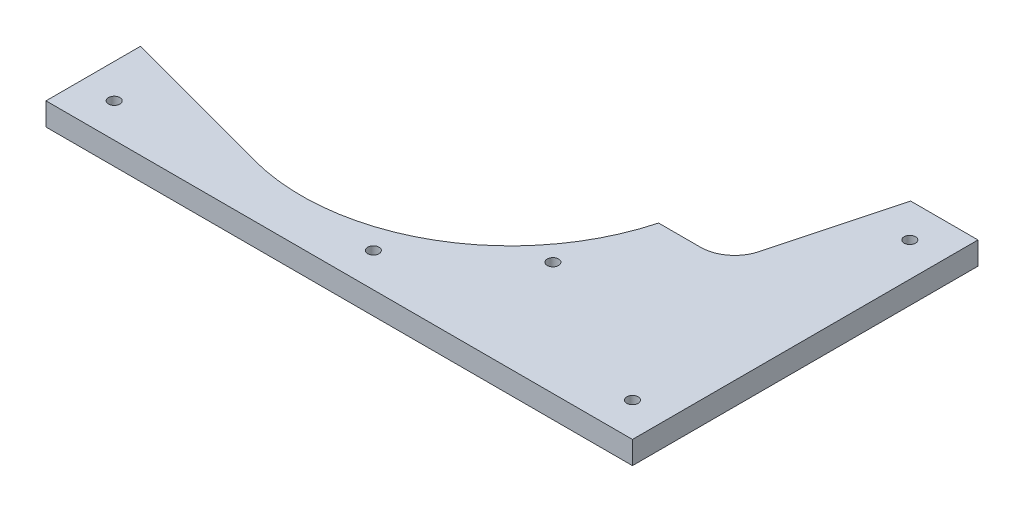
ISO-10303-21;
HEADER;
FILE_DESCRIPTION(('STEP AP214'),'2;1');
FILE_NAME('part.step','',(''),(''),'','','');
FILE_SCHEMA(('AUTOMOTIVE_DESIGN { 1 0 10303 214 1 1 1 1 }'));
ENDSEC;
DATA;
#1=APPLICATION_CONTEXT('core data for automotive mechanical design processes');
#2=APPLICATION_PROTOCOL_DEFINITION('international standard','automotive_design',2000,#1);
#3=PRODUCT_CONTEXT('',#1,'mechanical');
#4=PRODUCT('Part','Part','',(#3));
#5=PRODUCT_RELATED_PRODUCT_CATEGORY('part','',(#4));
#6=PRODUCT_DEFINITION_FORMATION('','',#4);
#7=PRODUCT_DEFINITION_CONTEXT('part definition',#1,'design');
#8=PRODUCT_DEFINITION('design','',#6,#7);
#9=PRODUCT_DEFINITION_SHAPE('','',#8);
#10=(LENGTH_UNIT() NAMED_UNIT(*) SI_UNIT(.MILLI.,.METRE.));
#11=(NAMED_UNIT(*) PLANE_ANGLE_UNIT() SI_UNIT($,.RADIAN.));
#12=(NAMED_UNIT(*) SI_UNIT($,.STERADIAN.) SOLID_ANGLE_UNIT());
#13=UNCERTAINTY_MEASURE_WITH_UNIT(LENGTH_MEASURE(1.E-05),#10,'distance_accuracy_value','');
#14=(GEOMETRIC_REPRESENTATION_CONTEXT(3) GLOBAL_UNCERTAINTY_ASSIGNED_CONTEXT((#13)) GLOBAL_UNIT_ASSIGNED_CONTEXT((#10,
#11,#12)) REPRESENTATION_CONTEXT('',''));
#15=CARTESIAN_POINT('',(0.,0.,0.));
#16=DIRECTION('',(0.,0.,1.));
#17=DIRECTION('',(1.,0.,0.));
#18=AXIS2_PLACEMENT_3D('',#15,#16,#17);
#19=CARTESIAN_POINT('',(0.,12.7,-116.84));
#20=DIRECTION('',(0.,-1.,0.));
#21=DIRECTION('',(0.,0.,-1.));
#22=AXIS2_PLACEMENT_3D('',#19,#20,#21);
#23=CYLINDRICAL_SURFACE('',#22,116.84);
#24=CARTESIAN_POINT('',(0.,0.,-116.84));
#25=DIRECTION('',(0.,1.,0.));
#26=DIRECTION('',(0.,0.,1.));
#27=AXIS2_PLACEMENT_3D('',#24,#25,#26);
#28=CIRCLE('',#27,116.84);
#29=CARTESIAN_POINT('',(-30.2404172297778,0.,-3.98122645638507));
#30=VERTEX_POINT('',#29);
#31=CARTESIAN_POINT('',(112.858773543615,0.,-86.5995827702219));
#32=VERTEX_POINT('',#31);
#33=EDGE_CURVE('E119',#30,#32,#28,.T.);
#34=ORIENTED_EDGE('',*,*,#33,.F.);
#35=DIRECTION('',(0.,-1.,0.));
#36=VECTOR('',#35,1.);
#37=CARTESIAN_POINT('',(-30.2404172297778,12.7,-3.98122645638507));
#38=LINE('',#37,#36);
#39=CARTESIAN_POINT('',(-30.2404172297778,12.7,-3.98122645638507));
#40=VERTEX_POINT('',#39);
#41=EDGE_CURVE('E113',#40,#30,#38,.T.);
#42=ORIENTED_EDGE('',*,*,#41,.F.);
#43=CARTESIAN_POINT('',(0.,12.7,-116.84));
#44=DIRECTION('',(0.,1.,0.));
#45=DIRECTION('',(0.,0.,1.));
#46=AXIS2_PLACEMENT_3D('',#43,#44,#45);
#47=CIRCLE('',#46,116.84);
#48=CARTESIAN_POINT('',(112.858773543615,12.7,-86.5995827702219));
#49=VERTEX_POINT('',#48);
#50=EDGE_CURVE('E116',#40,#49,#47,.T.);
#51=ORIENTED_EDGE('',*,*,#50,.T.);
#52=DIRECTION('',(0.,-1.,0.));
#53=VECTOR('',#52,1.);
#54=CARTESIAN_POINT('',(112.858773543615,12.7,-86.5995827702219));
#55=LINE('',#54,#53);
#56=EDGE_CURVE('E166',#49,#32,#55,.T.);
#57=ORIENTED_EDGE('',*,*,#56,.T.);
#58=EDGE_LOOP('',(#34,#42,#51,#57));
#59=FACE_BOUND('',#58,.T.);
#60=ADVANCED_FACE('F43',(#59),#23,.F.);
#61=CARTESIAN_POINT('',(-1.03041722977844,12.7,3.84556945452763));
#62=DIRECTION('',(-0.258819045102514,0.,0.96592582628907));
#63=DIRECTION('',(0.96592582628907,0.,0.258819045102514));
#64=AXIS2_PLACEMENT_3D('',#61,#62,#63);
#65=PLANE('',#64);
#66=DIRECTION('',(-0.96592582628907,0.,-0.258819045102514));
#67=VECTOR('',#66,1.);
#68=CARTESIAN_POINT('',(-1.03041722977844,0.,3.84556945452763));
#69=LINE('',#68,#67);
#70=CARTESIAN_POINT('',(-117.385646079675,0.,-27.3317201509397));
#71=VERTEX_POINT('',#70);
#72=EDGE_CURVE('E189',#30,#71,#69,.T.);
#73=ORIENTED_EDGE('',*,*,#72,.T.);
#74=DIRECTION('',(0.,-1.,0.));
#75=VECTOR('',#74,1.);
#76=CARTESIAN_POINT('',(-117.385646079675,12.7,-27.3317201509397));
#77=LINE('',#76,#75);
#78=CARTESIAN_POINT('',(-117.385646079675,12.7,-27.3317201509397));
#79=VERTEX_POINT('',#78);
#80=EDGE_CURVE('E125',#79,#71,#77,.T.);
#81=ORIENTED_EDGE('',*,*,#80,.F.);
#82=DIRECTION('',(-0.96592582628907,0.,-0.258819045102514));
#83=VECTOR('',#82,1.);
#84=CARTESIAN_POINT('',(-1.03041722977844,12.7,3.84556945452763));
#85=LINE('',#84,#83);
#86=EDGE_CURVE('E128',#40,#79,#85,.T.);
#87=ORIENTED_EDGE('',*,*,#86,.F.);
#88=ORIENTED_EDGE('',*,*,#41,.T.);
#89=EDGE_LOOP('',(#73,#81,#87,#88));
#90=FACE_BOUND('',#89,.T.);
#91=ADVANCED_FACE('F129',(#90),#65,.F.);
#92=CARTESIAN_POINT('',(-117.385646079675,12.7,0.));
#93=DIRECTION('',(-1.,0.,0.));
#94=DIRECTION('',(0.,0.,1.));
#95=AXIS2_PLACEMENT_3D('',#92,#93,#94);
#96=PLANE('',#95);
#97=DIRECTION('',(0.,0.,-1.));
#98=VECTOR('',#97,1.);
#99=CARTESIAN_POINT('',(-117.385646079675,0.,0.));
#100=LINE('',#99,#98);
#101=CARTESIAN_POINT('',(-117.385646079675,0.,25.4));
#102=VERTEX_POINT('',#101);
#103=EDGE_CURVE('E192',#102,#71,#100,.T.);
#104=ORIENTED_EDGE('',*,*,#103,.F.);
#105=DIRECTION('',(0.,-1.,0.));
#106=VECTOR('',#105,1.);
#107=CARTESIAN_POINT('',(-117.385646079675,12.7,25.4));
#108=LINE('',#107,#106);
#109=CARTESIAN_POINT('',(-117.385646079675,12.7,25.4));
#110=VERTEX_POINT('',#109);
#111=EDGE_CURVE('E227',#110,#102,#108,.T.);
#112=ORIENTED_EDGE('',*,*,#111,.F.);
#113=DIRECTION('',(0.,0.,-1.));
#114=VECTOR('',#113,1.);
#115=CARTESIAN_POINT('',(-117.385646079675,12.7,0.));
#116=LINE('',#115,#114);
#117=EDGE_CURVE('E134',#110,#79,#116,.T.);
#118=ORIENTED_EDGE('',*,*,#117,.T.);
#119=ORIENTED_EDGE('',*,*,#80,.T.);
#120=EDGE_LOOP('',(#104,#112,#118,#119));
#121=FACE_BOUND('',#120,.T.);
#122=ADVANCED_FACE('F248',(#121),#96,.T.);
#123=CARTESIAN_POINT('',(0.,12.7,25.4));
#124=DIRECTION('',(0.,0.,1.));
#125=DIRECTION('',(1.,0.,0.));
#126=AXIS2_PLACEMENT_3D('',#123,#124,#125);
#127=PLANE('',#126);
#128=DIRECTION('',(-1.,0.,0.));
#129=VECTOR('',#128,1.);
#130=CARTESIAN_POINT('',(0.,0.,25.4));
#131=LINE('',#130,#129);
#132=CARTESIAN_POINT('',(210.274353920325,0.,25.4));
#133=VERTEX_POINT('',#132);
#134=EDGE_CURVE('E196',#133,#102,#131,.T.);
#135=ORIENTED_EDGE('',*,*,#134,.F.);
#136=DIRECTION('',(0.,-1.,0.));
#137=VECTOR('',#136,1.);
#138=CARTESIAN_POINT('',(210.274353920325,12.7,25.4));
#139=LINE('',#138,#137);
#140=CARTESIAN_POINT('',(210.274353920325,12.7,25.4));
#141=VERTEX_POINT('',#140);
#142=EDGE_CURVE('E224',#141,#133,#139,.T.);
#143=ORIENTED_EDGE('',*,*,#142,.F.);
#144=DIRECTION('',(-1.,0.,0.));
#145=VECTOR('',#144,1.);
#146=CARTESIAN_POINT('',(0.,12.7,25.4));
#147=LINE('',#146,#145);
#148=EDGE_CURVE('E150',#141,#110,#147,.T.);
#149=ORIENTED_EDGE('',*,*,#148,.T.);
#150=ORIENTED_EDGE('',*,*,#111,.T.);
#151=EDGE_LOOP('',(#135,#143,#149,#150));
#152=FACE_BOUND('',#151,.T.);
#153=ADVANCED_FACE('F251',(#152),#127,.T.);
#154=CARTESIAN_POINT('',(210.274353920325,12.7,0.));
#155=DIRECTION('',(-1.,0.,0.));
#156=DIRECTION('',(0.,0.,1.));
#157=AXIS2_PLACEMENT_3D('',#154,#155,#156);
#158=PLANE('',#157);
#159=DIRECTION('',(0.,0.,-1.));
#160=VECTOR('',#159,1.);
#161=CARTESIAN_POINT('',(210.274353920325,0.,0.));
#162=LINE('',#161,#160);
#163=CARTESIAN_POINT('',(210.274353920325,0.,-167.64));
#164=VERTEX_POINT('',#163);
#165=EDGE_CURVE('E200',#133,#164,#162,.T.);
#166=ORIENTED_EDGE('',*,*,#165,.T.);
#167=DIRECTION('',(0.,-1.,0.));
#168=VECTOR('',#167,1.);
#169=CARTESIAN_POINT('',(210.274353920325,12.7,-167.64));
#170=LINE('',#169,#168);
#171=CARTESIAN_POINT('',(210.274353920325,12.7,-167.64));
#172=VERTEX_POINT('',#171);
#173=EDGE_CURVE('E221',#172,#164,#170,.T.);
#174=ORIENTED_EDGE('',*,*,#173,.F.);
#175=DIRECTION('',(0.,0.,-1.));
#176=VECTOR('',#175,1.);
#177=CARTESIAN_POINT('',(210.274353920325,12.7,0.));
#178=LINE('',#177,#176);
#179=EDGE_CURVE('E154',#141,#172,#178,.T.);
#180=ORIENTED_EDGE('',*,*,#179,.F.);
#181=ORIENTED_EDGE('',*,*,#142,.T.);
#182=EDGE_LOOP('',(#166,#174,#180,#181));
#183=FACE_BOUND('',#182,.T.);
#184=ADVANCED_FACE('F255',(#183),#158,.F.);
#185=CARTESIAN_POINT('',(0.,12.7,-167.64));
#186=DIRECTION('',(0.,0.,-1.));
#187=DIRECTION('',(-1.,0.,0.));
#188=AXIS2_PLACEMENT_3D('',#185,#186,#187);
#189=PLANE('',#188);
#190=DIRECTION('',(1.,0.,0.));
#191=VECTOR('',#190,1.);
#192=CARTESIAN_POINT('',(0.,0.,-167.64));
#193=LINE('',#192,#191);
#194=CARTESIAN_POINT('',(172.673487894615,0.,-167.64));
#195=VERTEX_POINT('',#194);
#196=EDGE_CURVE('E204',#195,#164,#193,.T.);
#197=ORIENTED_EDGE('',*,*,#196,.F.);
#198=DIRECTION('',(0.,-1.,0.));
#199=VECTOR('',#198,1.);
#200=CARTESIAN_POINT('',(172.673487894615,12.7,-167.64));
#201=LINE('',#200,#199);
#202=CARTESIAN_POINT('',(172.673487894615,12.7,-167.64));
#203=VERTEX_POINT('',#202);
#204=EDGE_CURVE('E217',#203,#195,#201,.T.);
#205=ORIENTED_EDGE('',*,*,#204,.F.);
#206=DIRECTION('',(1.,0.,0.));
#207=VECTOR('',#206,1.);
#208=CARTESIAN_POINT('',(0.,12.7,-167.64));
#209=LINE('',#208,#207);
#210=EDGE_CURVE('E157',#203,#172,#209,.T.);
#211=ORIENTED_EDGE('',*,*,#210,.T.);
#212=ORIENTED_EDGE('',*,*,#173,.T.);
#213=EDGE_LOOP('',(#197,#205,#211,#212));
#214=FACE_BOUND('',#213,.T.);
#215=ADVANCED_FACE('F260',(#214),#189,.T.);
#216=CARTESIAN_POINT('',(119.196557485709,12.7,31.9386213188652));
#217=DIRECTION('',(-0.965925826289069,0.,-0.258819045102518));
#218=DIRECTION('',(-0.258819045102518,0.,0.965925826289069));
#219=AXIS2_PLACEMENT_3D('',#216,#217,#218);
#220=PLANE('',#219);
#221=DIRECTION('',(0.258819045102518,0.,-0.965925826289069));
#222=VECTOR('',#221,1.);
#223=CARTESIAN_POINT('',(119.196557485709,0.,31.9386213188652));
#224=LINE('',#223,#222);
#225=CARTESIAN_POINT('',(154.742081413422,0.,-100.719079961019));
#226=VERTEX_POINT('',#225);
#227=EDGE_CURVE('E208',#226,#195,#224,.T.);
#228=ORIENTED_EDGE('',*,*,#227,.F.);
#229=DIRECTION('',(0.,-1.,0.));
#230=VECTOR('',#229,1.);
#231=CARTESIAN_POINT('',(154.742081413422,12.7,-100.719079961019));
#232=LINE('',#231,#230);
#233=CARTESIAN_POINT('',(154.742081413422,12.7,-100.719079961019));
#234=VERTEX_POINT('',#233);
#235=EDGE_CURVE('E59',#226,#234,#232,.F.);
#236=ORIENTED_EDGE('',*,*,#235,.T.);
#237=DIRECTION('',(0.258819045102518,0.,-0.965925826289069));
#238=VECTOR('',#237,1.);
#239=CARTESIAN_POINT('',(119.196557485709,12.7,31.9386213188652));
#240=LINE('',#239,#238);
#241=EDGE_CURVE('E161',#234,#203,#240,.T.);
#242=ORIENTED_EDGE('',*,*,#241,.T.);
#243=ORIENTED_EDGE('',*,*,#204,.T.);
#244=EDGE_LOOP('',(#228,#236,#242,#243));
#245=FACE_BOUND('',#244,.T.);
#246=ADVANCED_FACE('F261',(#245),#220,.T.);
#247=CARTESIAN_POINT('',(-98.3356460796747,12.7,6.35000000000001));
#248=DIRECTION('',(0.,-1.,0.));
#249=DIRECTION('',(0.,0.,-1.));
#250=AXIS2_PLACEMENT_3D('',#247,#248,#249);
#251=CYLINDRICAL_SURFACE('',#250,3.175);
#252=CARTESIAN_POINT('',(-98.3356460796747,12.7,6.35000000000001));
#253=DIRECTION('',(0.,1.,0.));
#254=DIRECTION('',(0.,0.,1.));
#255=AXIS2_PLACEMENT_3D('',#252,#253,#254);
#256=CIRCLE('',#255,3.175);
#257=CARTESIAN_POINT('',(-98.3356460796747,12.7,9.52500000000001));
#258=VERTEX_POINT('',#257);
#259=EDGE_CURVE('E140',#258,#258,#256,.T.);
#260=ORIENTED_EDGE('',*,*,#259,.T.);
#261=EDGE_LOOP('',(#260));
#262=FACE_BOUND('',#261,.T.);
#263=CARTESIAN_POINT('',(-98.3356460796747,0.,6.35000000000001));
#264=DIRECTION('',(0.,1.,0.));
#265=DIRECTION('',(0.,0.,1.));
#266=AXIS2_PLACEMENT_3D('',#263,#264,#265);
#267=CIRCLE('',#266,3.175);
#268=CARTESIAN_POINT('',(-98.3356460796747,0.,9.52500000000001));
#269=VERTEX_POINT('',#268);
#270=EDGE_CURVE('E183',#269,#269,#267,.T.);
#271=ORIENTED_EDGE('',*,*,#270,.F.);
#272=EDGE_LOOP('',(#271));
#273=FACE_BOUND('',#272,.T.);
#274=ADVANCED_FACE('F276',(#262,#273),#251,.F.);
#275=CARTESIAN_POINT('',(46.4443539203253,12.7,6.35));
#276=DIRECTION('',(0.,-1.,0.));
#277=DIRECTION('',(0.,0.,-1.));
#278=AXIS2_PLACEMENT_3D('',#275,#276,#277);
#279=CYLINDRICAL_SURFACE('',#278,3.175);
#280=CARTESIAN_POINT('',(46.4443539203253,12.7,6.35));
#281=DIRECTION('',(0.,1.,0.));
#282=DIRECTION('',(0.,0.,1.));
#283=AXIS2_PLACEMENT_3D('',#280,#281,#282);
#284=CIRCLE('',#283,3.175);
#285=CARTESIAN_POINT('',(46.4443539203253,12.7,9.525));
#286=VERTEX_POINT('',#285);
#287=EDGE_CURVE('E144',#286,#286,#284,.T.);
#288=ORIENTED_EDGE('',*,*,#287,.T.);
#289=EDGE_LOOP('',(#288));
#290=FACE_BOUND('',#289,.T.);
#291=CARTESIAN_POINT('',(46.4443539203253,0.,6.35));
#292=DIRECTION('',(0.,1.,0.));
#293=DIRECTION('',(0.,0.,1.));
#294=AXIS2_PLACEMENT_3D('',#291,#292,#293);
#295=CIRCLE('',#294,3.175);
#296=CARTESIAN_POINT('',(46.4443539203253,0.,9.525));
#297=VERTEX_POINT('',#296);
#298=EDGE_CURVE('E179',#297,#297,#295,.T.);
#299=ORIENTED_EDGE('',*,*,#298,.F.);
#300=EDGE_LOOP('',(#299));
#301=FACE_BOUND('',#300,.T.);
#302=ADVANCED_FACE('F279',(#290,#301),#279,.F.);
#303=CARTESIAN_POINT('',(102.324353920325,12.7,-38.1));
#304=DIRECTION('',(0.,-1.,0.));
#305=DIRECTION('',(0.,0.,-1.));
#306=AXIS2_PLACEMENT_3D('',#303,#304,#305);
#307=CYLINDRICAL_SURFACE('',#306,3.175);
#308=CARTESIAN_POINT('',(102.324353920325,12.7,-38.1));
#309=DIRECTION('',(0.,1.,0.));
#310=DIRECTION('',(0.,0.,1.));
#311=AXIS2_PLACEMENT_3D('',#308,#309,#310);
#312=CIRCLE('',#311,3.175);
#313=CARTESIAN_POINT('',(102.324353920325,12.7,-34.925));
#314=VERTEX_POINT('',#313);
#315=EDGE_CURVE('E320',#314,#314,#312,.T.);
#316=ORIENTED_EDGE('',*,*,#315,.T.);
#317=EDGE_LOOP('',(#316));
#318=FACE_BOUND('',#317,.T.);
#319=CARTESIAN_POINT('',(102.324353920325,0.,-38.1));
#320=DIRECTION('',(0.,1.,0.));
#321=DIRECTION('',(0.,0.,1.));
#322=AXIS2_PLACEMENT_3D('',#319,#320,#321);
#323=CIRCLE('',#322,3.175);
#324=CARTESIAN_POINT('',(102.324353920325,0.,-34.925));
#325=VERTEX_POINT('',#324);
#326=EDGE_CURVE('E175',#325,#325,#323,.T.);
#327=ORIENTED_EDGE('',*,*,#326,.F.);
#328=EDGE_LOOP('',(#327));
#329=FACE_BOUND('',#328,.T.);
#330=ADVANCED_FACE('F283',(#318,#329),#307,.F.);
#331=CARTESIAN_POINT('',(191.224353920325,12.7,-148.59));
#332=DIRECTION('',(0.,-1.,0.));
#333=DIRECTION('',(0.,0.,-1.));
#334=AXIS2_PLACEMENT_3D('',#331,#332,#333);
#335=CYLINDRICAL_SURFACE('',#334,3.175);
#336=CARTESIAN_POINT('',(191.224353920325,12.7,-148.59));
#337=DIRECTION('',(0.,1.,0.));
#338=DIRECTION('',(0.,0.,1.));
#339=AXIS2_PLACEMENT_3D('',#336,#337,#338);
#340=CIRCLE('',#339,3.175);
#341=CARTESIAN_POINT('',(191.224353920325,12.7,-145.415));
#342=VERTEX_POINT('',#341);
#343=EDGE_CURVE('E316',#342,#342,#340,.T.);
#344=ORIENTED_EDGE('',*,*,#343,.T.);
#345=EDGE_LOOP('',(#344));
#346=FACE_BOUND('',#345,.T.);
#347=CARTESIAN_POINT('',(191.224353920325,0.,-148.59));
#348=DIRECTION('',(0.,1.,0.));
#349=DIRECTION('',(0.,0.,1.));
#350=AXIS2_PLACEMENT_3D('',#347,#348,#349);
#351=CIRCLE('',#350,3.175);
#352=CARTESIAN_POINT('',(191.224353920325,0.,-145.415));
#353=VERTEX_POINT('',#352);
#354=EDGE_CURVE('E171',#353,#353,#351,.T.);
#355=ORIENTED_EDGE('',*,*,#354,.F.);
#356=EDGE_LOOP('',(#355));
#357=FACE_BOUND('',#356,.T.);
#358=ADVANCED_FACE('F287',(#346,#357),#335,.F.);
#359=CARTESIAN_POINT('',(191.224353920325,12.7,6.35));
#360=DIRECTION('',(0.,-1.,0.));
#361=DIRECTION('',(0.,0.,-1.));
#362=AXIS2_PLACEMENT_3D('',#359,#360,#361);
#363=CYLINDRICAL_SURFACE('',#362,3.175);
#364=CARTESIAN_POINT('',(191.224353920325,12.7,6.35));
#365=DIRECTION('',(0.,1.,0.));
#366=DIRECTION('',(0.,0.,1.));
#367=AXIS2_PLACEMENT_3D('',#364,#365,#366);
#368=CIRCLE('',#367,3.175);
#369=CARTESIAN_POINT('',(191.224353920325,12.7,9.525));
#370=VERTEX_POINT('',#369);
#371=EDGE_CURVE('E214',#370,#370,#368,.T.);
#372=ORIENTED_EDGE('',*,*,#371,.T.);
#373=EDGE_LOOP('',(#372));
#374=FACE_BOUND('',#373,.T.);
#375=CARTESIAN_POINT('',(191.224353920325,0.,6.35));
#376=DIRECTION('',(0.,1.,0.));
#377=DIRECTION('',(0.,0.,1.));
#378=AXIS2_PLACEMENT_3D('',#375,#376,#377);
#379=CIRCLE('',#378,3.175);
#380=CARTESIAN_POINT('',(191.224353920325,0.,9.525));
#381=VERTEX_POINT('',#380);
#382=EDGE_CURVE('E167',#381,#381,#379,.T.);
#383=ORIENTED_EDGE('',*,*,#382,.F.);
#384=EDGE_LOOP('',(#383));
#385=FACE_BOUND('',#384,.T.);
#386=ADVANCED_FACE('F290',(#374,#385),#363,.F.);
#387=CARTESIAN_POINT('',(0.,12.7,-86.5995827702219));
#388=DIRECTION('',(0.,0.,-1.));
#389=DIRECTION('',(-1.,0.,0.));
#390=AXIS2_PLACEMENT_3D('',#387,#388,#389);
#391=PLANE('',#390);
#392=DIRECTION('',(1.,0.,0.));
#393=VECTOR('',#392,1.);
#394=CARTESIAN_POINT('',(0.,12.7,-86.5995827702219));
#395=LINE('',#394,#393);
#396=CARTESIAN_POINT('',(136.341194422616,12.7,-86.5995827702219));
#397=VERTEX_POINT('',#396);
#398=EDGE_CURVE('E138',#49,#397,#395,.T.);
#399=ORIENTED_EDGE('',*,*,#398,.T.);
#400=DIRECTION('',(0.,-1.,0.));
#401=VECTOR('',#400,1.);
#402=CARTESIAN_POINT('',(136.341194422616,0.,-86.5995827702219));
#403=LINE('',#402,#401);
#404=CARTESIAN_POINT('',(136.341194422616,0.,-86.5995827702219));
#405=VERTEX_POINT('',#404);
#406=EDGE_CURVE('E124',#397,#405,#403,.T.);
#407=ORIENTED_EDGE('',*,*,#406,.T.);
#408=DIRECTION('',(1.,0.,0.));
#409=VECTOR('',#408,1.);
#410=CARTESIAN_POINT('',(0.,0.,-86.5995827702219));
#411=LINE('',#410,#409);
#412=EDGE_CURVE('E211',#32,#405,#411,.T.);
#413=ORIENTED_EDGE('',*,*,#412,.F.);
#414=ORIENTED_EDGE('',*,*,#56,.F.);
#415=EDGE_LOOP('',(#399,#407,#413,#414));
#416=FACE_BOUND('',#415,.T.);
#417=ADVANCED_FACE('F240',(#416),#391,.T.);
#418=CARTESIAN_POINT('',(0.,12.7,0.));
#419=DIRECTION('',(0.,1.,0.));
#420=DIRECTION('',(0.,0.,1.));
#421=AXIS2_PLACEMENT_3D('',#418,#419,#420);
#422=PLANE('',#421);
#423=ORIENTED_EDGE('',*,*,#371,.F.);
#424=EDGE_LOOP('',(#423));
#425=FACE_BOUND('',#424,.T.);
#426=ORIENTED_EDGE('',*,*,#343,.F.);
#427=EDGE_LOOP('',(#426));
#428=FACE_BOUND('',#427,.T.);
#429=ORIENTED_EDGE('',*,*,#315,.F.);
#430=EDGE_LOOP('',(#429));
#431=FACE_BOUND('',#430,.T.);
#432=ORIENTED_EDGE('',*,*,#287,.F.);
#433=EDGE_LOOP('',(#432));
#434=FACE_BOUND('',#433,.T.);
#435=ORIENTED_EDGE('',*,*,#259,.F.);
#436=EDGE_LOOP('',(#435));
#437=FACE_BOUND('',#436,.T.);
#438=ORIENTED_EDGE('',*,*,#50,.F.);
#439=ORIENTED_EDGE('',*,*,#86,.T.);
#440=ORIENTED_EDGE('',*,*,#117,.F.);
#441=ORIENTED_EDGE('',*,*,#148,.F.);
#442=ORIENTED_EDGE('',*,*,#179,.T.);
#443=ORIENTED_EDGE('',*,*,#210,.F.);
#444=ORIENTED_EDGE('',*,*,#241,.F.);
#445=CARTESIAN_POINT('',(136.341194422616,12.7,-105.649582770222));
#446=DIRECTION('',(0.,1.,0.));
#447=DIRECTION('',(0.,0.,1.));
#448=AXIS2_PLACEMENT_3D('',#445,#446,#447);
#449=CIRCLE('',#448,19.05);
#450=EDGE_CURVE('E11',#234,#397,#449,.F.);
#451=ORIENTED_EDGE('',*,*,#450,.T.);
#452=ORIENTED_EDGE('',*,*,#398,.F.);
#453=EDGE_LOOP('',(#438,#439,#440,#441,#442,#443,#444,#451,#452));
#454=FACE_BOUND('',#453,.T.);
#455=ADVANCED_FACE('F136',(#425,#428,#431,#434,#437,#454),#422,.T.);
#456=CARTESIAN_POINT('',(0.,0.,0.));
#457=DIRECTION('',(0.,1.,0.));
#458=DIRECTION('',(0.,0.,1.));
#459=AXIS2_PLACEMENT_3D('',#456,#457,#458);
#460=PLANE('',#459);
#461=ORIENTED_EDGE('',*,*,#382,.T.);
#462=EDGE_LOOP('',(#461));
#463=FACE_BOUND('',#462,.T.);
#464=ORIENTED_EDGE('',*,*,#354,.T.);
#465=EDGE_LOOP('',(#464));
#466=FACE_BOUND('',#465,.T.);
#467=ORIENTED_EDGE('',*,*,#326,.T.);
#468=EDGE_LOOP('',(#467));
#469=FACE_BOUND('',#468,.T.);
#470=ORIENTED_EDGE('',*,*,#298,.T.);
#471=EDGE_LOOP('',(#470));
#472=FACE_BOUND('',#471,.T.);
#473=ORIENTED_EDGE('',*,*,#270,.T.);
#474=EDGE_LOOP('',(#473));
#475=FACE_BOUND('',#474,.T.);
#476=ORIENTED_EDGE('',*,*,#33,.T.);
#477=ORIENTED_EDGE('',*,*,#412,.T.);
#478=CARTESIAN_POINT('',(136.341194422616,0.,-105.649582770222));
#479=DIRECTION('',(0.,1.,0.));
#480=DIRECTION('',(0.,0.,1.));
#481=AXIS2_PLACEMENT_3D('',#478,#479,#480);
#482=CIRCLE('',#481,19.05);
#483=EDGE_CURVE('E52',#405,#226,#482,.T.);
#484=ORIENTED_EDGE('',*,*,#483,.T.);
#485=ORIENTED_EDGE('',*,*,#227,.T.);
#486=ORIENTED_EDGE('',*,*,#196,.T.);
#487=ORIENTED_EDGE('',*,*,#165,.F.);
#488=ORIENTED_EDGE('',*,*,#134,.T.);
#489=ORIENTED_EDGE('',*,*,#103,.T.);
#490=ORIENTED_EDGE('',*,*,#72,.F.);
#491=EDGE_LOOP('',(#476,#477,#484,#485,#486,#487,#488,#489,#490));
#492=FACE_BOUND('',#491,.T.);
#493=ADVANCED_FACE('F243',(#463,#466,#469,#472,#475,#492),#460,.F.);
#494=CARTESIAN_POINT('',(136.341194422616,12.7,-105.649582770222));
#495=DIRECTION('',(0.,1.,0.));
#496=DIRECTION('',(0.,0.,1.));
#497=AXIS2_PLACEMENT_3D('',#494,#495,#496);
#498=CYLINDRICAL_SURFACE('',#497,19.05);
#499=ORIENTED_EDGE('',*,*,#450,.F.);
#500=ORIENTED_EDGE('',*,*,#235,.F.);
#501=ORIENTED_EDGE('',*,*,#483,.F.);
#502=ORIENTED_EDGE('',*,*,#406,.F.);
#503=EDGE_LOOP('',(#499,#500,#501,#502));
#504=FACE_BOUND('',#503,.T.);
#505=ADVANCED_FACE('F45',(#504),#498,.F.);
#506=CLOSED_SHELL('',(#60,#91,#122,#153,#184,#215,#246,#274,#302,#330,#358,#386,#417,#455,#493,#505));
#507=MANIFOLD_SOLID_BREP('B2',#506);
#508=ADVANCED_BREP_SHAPE_REPRESENTATION('',(#18,#507),#14);
#509=SHAPE_DEFINITION_REPRESENTATION(#9,#508);
ENDSEC;
END-ISO-10303-21;
